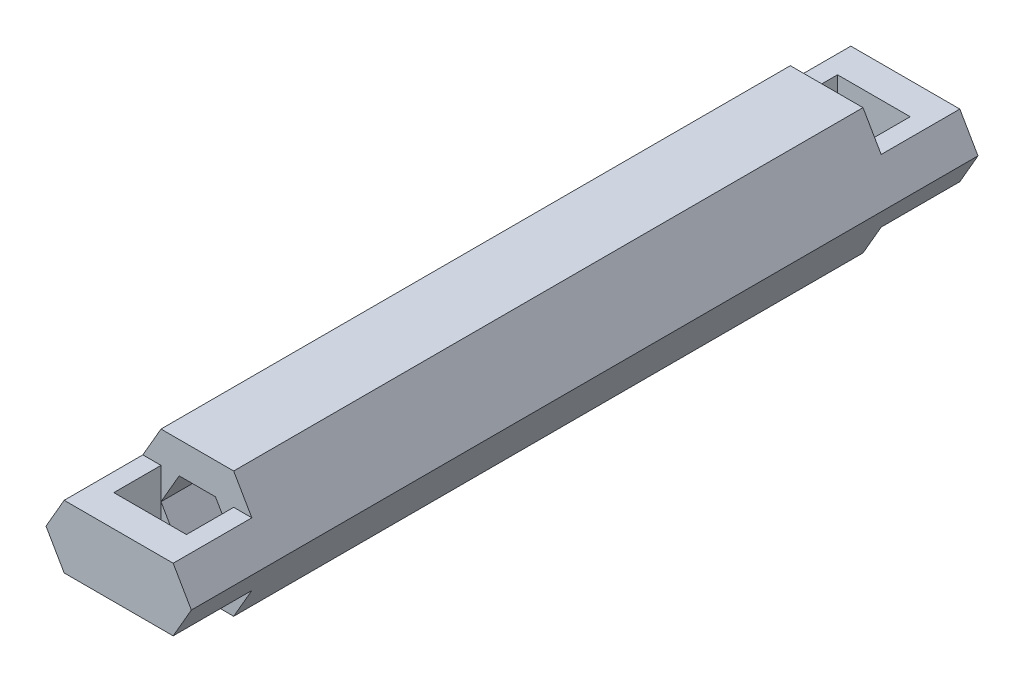
ISO-10303-21;
HEADER;
FILE_DESCRIPTION(('STEP AP214'),'2;1');
FILE_NAME('part.step','',(''),(''),'','','');
FILE_SCHEMA(('AUTOMOTIVE_DESIGN { 1 0 10303 214 1 1 1 1 }'));
ENDSEC;
DATA;
#1=APPLICATION_CONTEXT('core data for automotive mechanical design processes');
#2=APPLICATION_PROTOCOL_DEFINITION('international standard','automotive_design',2000,#1);
#3=PRODUCT_CONTEXT('',#1,'mechanical');
#4=PRODUCT('Part','Part','',(#3));
#5=PRODUCT_RELATED_PRODUCT_CATEGORY('part','',(#4));
#6=PRODUCT_DEFINITION_FORMATION('','',#4);
#7=PRODUCT_DEFINITION_CONTEXT('part definition',#1,'design');
#8=PRODUCT_DEFINITION('design','',#6,#7);
#9=PRODUCT_DEFINITION_SHAPE('','',#8);
#10=(LENGTH_UNIT() NAMED_UNIT(*) SI_UNIT(.MILLI.,.METRE.));
#11=(NAMED_UNIT(*) PLANE_ANGLE_UNIT() SI_UNIT($,.RADIAN.));
#12=(NAMED_UNIT(*) SI_UNIT($,.STERADIAN.) SOLID_ANGLE_UNIT());
#13=UNCERTAINTY_MEASURE_WITH_UNIT(LENGTH_MEASURE(1.E-05),#10,'distance_accuracy_value','');
#14=(GEOMETRIC_REPRESENTATION_CONTEXT(3) GLOBAL_UNCERTAINTY_ASSIGNED_CONTEXT((#13)) GLOBAL_UNIT_ASSIGNED_CONTEXT((#10,
#11,#12)) REPRESENTATION_CONTEXT('',''));
#15=CARTESIAN_POINT('',(0.,0.,0.));
#16=DIRECTION('',(0.,0.,1.));
#17=DIRECTION('',(1.,0.,0.));
#18=AXIS2_PLACEMENT_3D('',#15,#16,#17);
#19=CARTESIAN_POINT('',(0.,0.,0.));
#20=DIRECTION('',(0.,0.,1.));
#21=DIRECTION('',(1.,0.,0.));
#22=AXIS2_PLACEMENT_3D('',#19,#20,#21);
#23=PLANE('',#22);
#24=DIRECTION('',(0.,1.,0.));
#25=VECTOR('',#24,1.);
#26=CARTESIAN_POINT('',(-5.7735026918962,-5.00000000000001,0.));
#27=LINE('',#26,#25);
#28=CARTESIAN_POINT('',(-5.77350269189623,0.,0.));
#29=VERTEX_POINT('',#28);
#30=CARTESIAN_POINT('',(-5.77350269189627,5.00000000000001,0.));
#31=VERTEX_POINT('',#30);
#32=EDGE_CURVE('E259',#29,#31,#27,.T.);
#33=ORIENTED_EDGE('',*,*,#32,.T.);
#34=DIRECTION('',(-1.,0.,0.));
#35=VECTOR('',#34,1.);
#36=CARTESIAN_POINT('',(-8.66025403784437,5.00000000000001,0.));
#37=LINE('',#36,#35);
#38=CARTESIAN_POINT('',(-8.66025403784437,5.00000000000001,0.));
#39=VERTEX_POINT('',#38);
#40=EDGE_CURVE('E256',#31,#39,#37,.T.);
#41=ORIENTED_EDGE('',*,*,#40,.T.);
#42=DIRECTION('',(-0.5,-0.866025403784439,0.));
#43=VECTOR('',#42,1.);
#44=CARTESIAN_POINT('',(-5.77350269189626,10.,0.));
#45=LINE('',#44,#43);
#46=CARTESIAN_POINT('',(-5.77350269189626,10.,0.));
#47=VERTEX_POINT('',#46);
#48=EDGE_CURVE('E424',#47,#39,#45,.T.);
#49=ORIENTED_EDGE('',*,*,#48,.F.);
#50=DIRECTION('',(-1.,0.,0.));
#51=VECTOR('',#50,1.);
#52=CARTESIAN_POINT('',(5.77350269189625,10.,0.));
#53=LINE('',#52,#51);
#54=CARTESIAN_POINT('',(5.77350269189625,10.,0.));
#55=VERTEX_POINT('',#54);
#56=EDGE_CURVE('E422',#55,#47,#53,.T.);
#57=ORIENTED_EDGE('',*,*,#56,.F.);
#58=DIRECTION('',(-0.5,0.866025403784439,0.));
#59=VECTOR('',#58,1.);
#60=CARTESIAN_POINT('',(11.5470053837925,0.,0.));
#61=LINE('',#60,#59);
#62=CARTESIAN_POINT('',(8.66025403784437,5.00000000000001,0.));
#63=VERTEX_POINT('',#62);
#64=EDGE_CURVE('E420',#63,#55,#61,.T.);
#65=ORIENTED_EDGE('',*,*,#64,.F.);
#66=DIRECTION('',(-1.,0.,0.));
#67=VECTOR('',#66,1.);
#68=CARTESIAN_POINT('',(5.77350269189627,5.00000000000001,0.));
#69=LINE('',#68,#67);
#70=CARTESIAN_POINT('',(5.77350269189627,5.00000000000001,0.));
#71=VERTEX_POINT('',#70);
#72=EDGE_CURVE('E275',#63,#71,#69,.T.);
#73=ORIENTED_EDGE('',*,*,#72,.T.);
#74=DIRECTION('',(0.,-1.,0.));
#75=VECTOR('',#74,1.);
#76=CARTESIAN_POINT('',(5.77350269189634,-5.00000000000001,0.));
#77=LINE('',#76,#75);
#78=CARTESIAN_POINT('',(5.7735026918963,0.,0.));
#79=VERTEX_POINT('',#78);
#80=EDGE_CURVE('E44',#71,#79,#77,.T.);
#81=ORIENTED_EDGE('',*,*,#80,.T.);
#82=DIRECTION('',(-0.500000000000001,0.866025403784438,0.));
#83=VECTOR('',#82,1.);
#84=CARTESIAN_POINT('',(5.77350269189626,0.,0.));
#85=LINE('',#84,#83);
#86=CARTESIAN_POINT('',(2.88675134594812,5.00000000000001,0.));
#87=VERTEX_POINT('',#86);
#88=EDGE_CURVE('E375',#79,#87,#85,.T.);
#89=ORIENTED_EDGE('',*,*,#88,.T.);
#90=DIRECTION('',(-1.,0.,0.));
#91=VECTOR('',#90,1.);
#92=CARTESIAN_POINT('',(2.88675134594812,5.00000000000001,0.));
#93=LINE('',#92,#91);
#94=CARTESIAN_POINT('',(-2.88675134594815,4.99999999999999,0.));
#95=VERTEX_POINT('',#94);
#96=EDGE_CURVE('E378',#87,#95,#93,.T.);
#97=ORIENTED_EDGE('',*,*,#96,.T.);
#98=DIRECTION('',(-0.499999999999995,-0.866025403784441,0.));
#99=VECTOR('',#98,1.);
#100=CARTESIAN_POINT('',(-2.88675134594815,4.99999999999999,0.));
#101=LINE('',#100,#99);
#102=EDGE_CURVE('E381',#95,#29,#101,.T.);
#103=ORIENTED_EDGE('',*,*,#102,.T.);
#104=EDGE_LOOP('',(#33,#41,#49,#57,#65,#73,#81,#89,#97,#103));
#105=FACE_BOUND('',#104,.T.);
#106=ADVANCED_FACE('F33',(#105),#23,.F.);
#107=CARTESIAN_POINT('',(5.77350269189634,-5.00000000000001,112.5));
#108=DIRECTION('',(1.,0.,0.));
#109=DIRECTION('',(0.,1.,0.));
#110=AXIS2_PLACEMENT_3D('',#107,#108,#109);
#111=PLANE('',#110);
#112=DIRECTION('',(0.,1.,0.));
#113=VECTOR('',#112,1.);
#114=CARTESIAN_POINT('',(5.77350269189627,4.99999999999999,107.5));
#115=LINE('',#114,#113);
#116=CARTESIAN_POINT('',(5.77350269189634,-5.00000000000003,107.5));
#117=VERTEX_POINT('',#116);
#118=CARTESIAN_POINT('',(5.77350269189627,4.99999999999999,107.5));
#119=VERTEX_POINT('',#118);
#120=EDGE_CURVE('E293',#117,#119,#115,.T.);
#121=ORIENTED_EDGE('',*,*,#120,.T.);
#122=DIRECTION('',(0.,0.,-1.));
#123=VECTOR('',#122,1.);
#124=CARTESIAN_POINT('',(5.77350269189627,5.00000000000001,112.5));
#125=LINE('',#124,#123);
#126=CARTESIAN_POINT('',(5.77350269189627,5.00000000000001,100.));
#127=VERTEX_POINT('',#126);
#128=EDGE_CURVE('E350',#119,#127,#125,.T.);
#129=ORIENTED_EDGE('',*,*,#128,.T.);
#130=DIRECTION('',(0.,-1.,0.));
#131=VECTOR('',#130,1.);
#132=CARTESIAN_POINT('',(5.77350269189634,-5.00000000000001,100.));
#133=LINE('',#132,#131);
#134=CARTESIAN_POINT('',(5.77350269189626,0.,100.));
#135=VERTEX_POINT('',#134);
#136=EDGE_CURVE('E341',#127,#135,#133,.T.);
#137=ORIENTED_EDGE('',*,*,#136,.T.);
#138=CARTESIAN_POINT('',(5.77350269189634,-5.00000000000001,100.));
#139=VERTEX_POINT('',#138);
#140=EDGE_CURVE('E42',#135,#139,#133,.T.);
#141=ORIENTED_EDGE('',*,*,#140,.T.);
#142=DIRECTION('',(0.,0.,-1.));
#143=VECTOR('',#142,1.);
#144=CARTESIAN_POINT('',(5.77350269189634,-5.00000000000001,112.5));
#145=LINE('',#144,#143);
#146=EDGE_CURVE('E348',#117,#139,#145,.T.);
#147=ORIENTED_EDGE('',*,*,#146,.F.);
#148=EDGE_LOOP('',(#121,#129,#137,#141,#147));
#149=FACE_BOUND('',#148,.T.);
#150=ADVANCED_FACE('F445',(#149),#111,.F.);
#151=CARTESIAN_POINT('',(-5.7735026918962,-5.00000000000001,112.5));
#152=DIRECTION('',(-1.,0.,0.));
#153=DIRECTION('',(0.,-1.,0.));
#154=AXIS2_PLACEMENT_3D('',#151,#152,#153);
#155=PLANE('',#154);
#156=DIRECTION('',(0.,1.,0.));
#157=VECTOR('',#156,1.);
#158=CARTESIAN_POINT('',(-5.77350269189627,4.9999999999999,107.5));
#159=LINE('',#158,#157);
#160=CARTESIAN_POINT('',(-5.7735026918962,-5.00000000000011,107.5));
#161=VERTEX_POINT('',#160);
#162=CARTESIAN_POINT('',(-5.77350269189627,4.9999999999999,107.5));
#163=VERTEX_POINT('',#162);
#164=EDGE_CURVE('E294',#161,#163,#159,.T.);
#165=ORIENTED_EDGE('',*,*,#164,.F.);
#166=DIRECTION('',(0.,0.,-1.));
#167=VECTOR('',#166,1.);
#168=CARTESIAN_POINT('',(-5.7735026918962,-5.00000000000001,112.5));
#169=LINE('',#168,#167);
#170=CARTESIAN_POINT('',(-5.7735026918962,-5.00000000000001,100.));
#171=VERTEX_POINT('',#170);
#172=EDGE_CURVE('E321',#161,#171,#169,.T.);
#173=ORIENTED_EDGE('',*,*,#172,.T.);
#174=DIRECTION('',(0.,1.,0.));
#175=VECTOR('',#174,1.);
#176=CARTESIAN_POINT('',(-5.7735026918962,-5.00000000000001,100.));
#177=LINE('',#176,#175);
#178=CARTESIAN_POINT('',(-5.77350269189626,0.,100.));
#179=VERTEX_POINT('',#178);
#180=EDGE_CURVE('E312',#171,#179,#177,.T.);
#181=ORIENTED_EDGE('',*,*,#180,.T.);
#182=CARTESIAN_POINT('',(-5.77350269189627,5.00000000000001,100.));
#183=VERTEX_POINT('',#182);
#184=EDGE_CURVE('E311',#179,#183,#177,.T.);
#185=ORIENTED_EDGE('',*,*,#184,.T.);
#186=DIRECTION('',(0.,0.,-1.));
#187=VECTOR('',#186,1.);
#188=CARTESIAN_POINT('',(-5.77350269189627,5.00000000000001,112.5));
#189=LINE('',#188,#187);
#190=EDGE_CURVE('E319',#163,#183,#189,.T.);
#191=ORIENTED_EDGE('',*,*,#190,.F.);
#192=EDGE_LOOP('',(#165,#173,#181,#185,#191));
#193=FACE_BOUND('',#192,.T.);
#194=ADVANCED_FACE('F494',(#193),#155,.F.);
#195=CARTESIAN_POINT('',(0.,0.,100.));
#196=DIRECTION('',(0.,0.,1.));
#197=DIRECTION('',(1.,0.,0.));
#198=AXIS2_PLACEMENT_3D('',#195,#196,#197);
#199=PLANE('',#198);
#200=ORIENTED_EDGE('',*,*,#180,.F.);
#201=DIRECTION('',(1.,0.,0.));
#202=VECTOR('',#201,1.);
#203=CARTESIAN_POINT('',(-8.66025403784437,-5.00000000000001,100.));
#204=LINE('',#203,#202);
#205=CARTESIAN_POINT('',(-8.66025403784437,-5.00000000000001,100.));
#206=VERTEX_POINT('',#205);
#207=EDGE_CURVE('E297',#206,#171,#204,.T.);
#208=ORIENTED_EDGE('',*,*,#207,.F.);
#209=DIRECTION('',(0.5,-0.866025403784438,0.));
#210=VECTOR('',#209,1.);
#211=CARTESIAN_POINT('',(-11.5470053837925,0.,100.));
#212=LINE('',#211,#210);
#213=CARTESIAN_POINT('',(-5.77350269189626,-10.,100.));
#214=VERTEX_POINT('',#213);
#215=EDGE_CURVE('E413',#206,#214,#212,.T.);
#216=ORIENTED_EDGE('',*,*,#215,.T.);
#217=DIRECTION('',(1.,0.,0.));
#218=VECTOR('',#217,1.);
#219=CARTESIAN_POINT('',(-5.77350269189626,-10.,100.));
#220=LINE('',#219,#218);
#221=CARTESIAN_POINT('',(5.77350269189626,-10.,100.));
#222=VERTEX_POINT('',#221);
#223=EDGE_CURVE('E415',#214,#222,#220,.T.);
#224=ORIENTED_EDGE('',*,*,#223,.T.);
#225=DIRECTION('',(0.5,0.866025403784439,0.));
#226=VECTOR('',#225,1.);
#227=CARTESIAN_POINT('',(5.77350269189626,-10.,100.));
#228=LINE('',#227,#226);
#229=CARTESIAN_POINT('',(8.66025403784438,-5.00000000000001,100.));
#230=VERTEX_POINT('',#229);
#231=EDGE_CURVE('E404',#222,#230,#228,.T.);
#232=ORIENTED_EDGE('',*,*,#231,.T.);
#233=DIRECTION('',(1.,0.,0.));
#234=VECTOR('',#233,1.);
#235=CARTESIAN_POINT('',(5.77350269189634,-5.00000000000001,100.));
#236=LINE('',#235,#234);
#237=EDGE_CURVE('E331',#139,#230,#236,.T.);
#238=ORIENTED_EDGE('',*,*,#237,.F.);
#239=ORIENTED_EDGE('',*,*,#140,.F.);
#240=DIRECTION('',(0.499999999999995,0.866025403784442,0.));
#241=VECTOR('',#240,1.);
#242=CARTESIAN_POINT('',(2.88675134594819,-4.99999999999997,100.));
#243=LINE('',#242,#241);
#244=CARTESIAN_POINT('',(2.88675134594819,-4.99999999999997,100.));
#245=VERTEX_POINT('',#244);
#246=EDGE_CURVE('E356',#245,#135,#243,.T.);
#247=ORIENTED_EDGE('',*,*,#246,.F.);
#248=DIRECTION('',(1.,0.,0.));
#249=VECTOR('',#248,1.);
#250=CARTESIAN_POINT('',(-2.88675134594808,-5.00000000000003,100.));
#251=LINE('',#250,#249);
#252=CARTESIAN_POINT('',(-2.88675134594808,-5.00000000000003,100.));
#253=VERTEX_POINT('',#252);
#254=EDGE_CURVE('E370',#253,#245,#251,.T.);
#255=ORIENTED_EDGE('',*,*,#254,.F.);
#256=DIRECTION('',(0.500000000000007,-0.866025403784434,0.));
#257=VECTOR('',#256,1.);
#258=CARTESIAN_POINT('',(-5.77350269189626,0.,100.));
#259=LINE('',#258,#257);
#260=EDGE_CURVE('E367',#179,#253,#259,.T.);
#261=ORIENTED_EDGE('',*,*,#260,.F.);
#262=EDGE_LOOP('',(#200,#208,#216,#224,#232,#238,#239,#247,#255,#261));
#263=FACE_BOUND('',#262,.T.);
#264=ADVANCED_FACE('F451',(#263),#199,.T.);
#265=DIRECTION('',(-1.,0.,0.));
#266=VECTOR('',#265,1.);
#267=CARTESIAN_POINT('',(-8.66025403784437,5.00000000000001,100.));
#268=LINE('',#267,#266);
#269=CARTESIAN_POINT('',(-8.66025403784439,5.,100.));
#270=VERTEX_POINT('',#269);
#271=EDGE_CURVE('E306',#183,#270,#268,.T.);
#272=ORIENTED_EDGE('',*,*,#271,.F.);
#273=ORIENTED_EDGE('',*,*,#184,.F.);
#274=DIRECTION('',(-0.499999999999995,-0.866025403784441,0.));
#275=VECTOR('',#274,1.);
#276=CARTESIAN_POINT('',(-2.88675134594815,4.99999999999999,100.));
#277=LINE('',#276,#275);
#278=CARTESIAN_POINT('',(-2.88675134594815,4.99999999999999,100.));
#279=VERTEX_POINT('',#278);
#280=EDGE_CURVE('E364',#279,#179,#277,.T.);
#281=ORIENTED_EDGE('',*,*,#280,.F.);
#282=DIRECTION('',(-1.,0.,0.));
#283=VECTOR('',#282,1.);
#284=CARTESIAN_POINT('',(2.88675134594812,5.00000000000001,100.));
#285=LINE('',#284,#283);
#286=CARTESIAN_POINT('',(2.88675134594812,5.00000000000001,100.));
#287=VERTEX_POINT('',#286);
#288=EDGE_CURVE('E362',#287,#279,#285,.T.);
#289=ORIENTED_EDGE('',*,*,#288,.F.);
#290=DIRECTION('',(-0.500000000000001,0.866025403784438,0.));
#291=VECTOR('',#290,1.);
#292=CARTESIAN_POINT('',(5.77350269189626,0.,100.));
#293=LINE('',#292,#291);
#294=EDGE_CURVE('E359',#135,#287,#293,.T.);
#295=ORIENTED_EDGE('',*,*,#294,.F.);
#296=ORIENTED_EDGE('',*,*,#136,.F.);
#297=DIRECTION('',(-1.,0.,0.));
#298=VECTOR('',#297,1.);
#299=CARTESIAN_POINT('',(5.77350269189627,5.00000000000001,100.));
#300=LINE('',#299,#298);
#301=CARTESIAN_POINT('',(8.66025403784438,5.00000000000001,100.));
#302=VERTEX_POINT('',#301);
#303=EDGE_CURVE('E326',#302,#127,#300,.T.);
#304=ORIENTED_EDGE('',*,*,#303,.F.);
#305=DIRECTION('',(-0.5,0.866025403784439,0.));
#306=VECTOR('',#305,1.);
#307=CARTESIAN_POINT('',(11.5470053837925,0.,100.));
#308=LINE('',#307,#306);
#309=CARTESIAN_POINT('',(5.77350269189625,10.,100.));
#310=VERTEX_POINT('',#309);
#311=EDGE_CURVE('E406',#302,#310,#308,.T.);
#312=ORIENTED_EDGE('',*,*,#311,.T.);
#313=DIRECTION('',(-1.,0.,0.));
#314=VECTOR('',#313,1.);
#315=CARTESIAN_POINT('',(5.77350269189625,10.,100.));
#316=LINE('',#315,#314);
#317=CARTESIAN_POINT('',(-5.77350269189626,10.,100.));
#318=VERTEX_POINT('',#317);
#319=EDGE_CURVE('E409',#310,#318,#316,.T.);
#320=ORIENTED_EDGE('',*,*,#319,.T.);
#321=DIRECTION('',(-0.5,-0.866025403784439,0.));
#322=VECTOR('',#321,1.);
#323=CARTESIAN_POINT('',(-5.77350269189626,10.,100.));
#324=LINE('',#323,#322);
#325=EDGE_CURVE('E411',#318,#270,#324,.T.);
#326=ORIENTED_EDGE('',*,*,#325,.T.);
#327=EDGE_LOOP('',(#272,#273,#281,#289,#295,#296,#304,#312,#320,#326));
#328=FACE_BOUND('',#327,.T.);
#329=ADVANCED_FACE('F465',(#328),#199,.T.);
#330=DIRECTION('',(1.,0.,0.));
#331=VECTOR('',#330,1.);
#332=CARTESIAN_POINT('',(-8.66025403784437,-5.00000000000001,0.));
#333=LINE('',#332,#331);
#334=CARTESIAN_POINT('',(-8.66025403784438,-5.00000000000001,0.));
#335=VERTEX_POINT('',#334);
#336=CARTESIAN_POINT('',(-5.7735026918962,-5.00000000000001,0.));
#337=VERTEX_POINT('',#336);
#338=EDGE_CURVE('E244',#335,#337,#333,.T.);
#339=ORIENTED_EDGE('',*,*,#338,.T.);
#340=EDGE_CURVE('E261',#337,#29,#27,.T.);
#341=ORIENTED_EDGE('',*,*,#340,.T.);
#342=DIRECTION('',(0.500000000000007,-0.866025403784434,0.));
#343=VECTOR('',#342,1.);
#344=CARTESIAN_POINT('',(-5.77350269189626,0.,0.));
#345=LINE('',#344,#343);
#346=CARTESIAN_POINT('',(-2.88675134594808,-5.00000000000003,0.));
#347=VERTEX_POINT('',#346);
#348=EDGE_CURVE('E384',#29,#347,#345,.T.);
#349=ORIENTED_EDGE('',*,*,#348,.T.);
#350=DIRECTION('',(1.,0.,0.));
#351=VECTOR('',#350,1.);
#352=CARTESIAN_POINT('',(-2.88675134594808,-5.00000000000003,0.));
#353=LINE('',#352,#351);
#354=CARTESIAN_POINT('',(2.88675134594819,-4.99999999999997,0.));
#355=VERTEX_POINT('',#354);
#356=EDGE_CURVE('E360',#347,#355,#353,.T.);
#357=ORIENTED_EDGE('',*,*,#356,.T.);
#358=DIRECTION('',(0.499999999999995,0.866025403784442,0.));
#359=VECTOR('',#358,1.);
#360=CARTESIAN_POINT('',(2.88675134594819,-4.99999999999997,0.));
#361=LINE('',#360,#359);
#362=EDGE_CURVE('E355',#355,#79,#361,.T.);
#363=ORIENTED_EDGE('',*,*,#362,.T.);
#364=CARTESIAN_POINT('',(5.77350269189634,-5.00000000000001,0.));
#365=VERTEX_POINT('',#364);
#366=EDGE_CURVE('E11',#79,#365,#77,.T.);
#367=ORIENTED_EDGE('',*,*,#366,.T.);
#368=DIRECTION('',(1.,0.,0.));
#369=VECTOR('',#368,1.);
#370=CARTESIAN_POINT('',(5.77350269189634,-5.00000000000001,0.));
#371=LINE('',#370,#369);
#372=CARTESIAN_POINT('',(8.66025403784438,-5.00000000000001,0.));
#373=VERTEX_POINT('',#372);
#374=EDGE_CURVE('E270',#365,#373,#371,.T.);
#375=ORIENTED_EDGE('',*,*,#374,.T.);
#376=DIRECTION('',(0.5,0.866025403784439,0.));
#377=VECTOR('',#376,1.);
#378=CARTESIAN_POINT('',(5.77350269189626,-10.,0.));
#379=LINE('',#378,#377);
#380=CARTESIAN_POINT('',(5.77350269189626,-10.,0.));
#381=VERTEX_POINT('',#380);
#382=EDGE_CURVE('E403',#381,#373,#379,.T.);
#383=ORIENTED_EDGE('',*,*,#382,.F.);
#384=DIRECTION('',(1.,0.,0.));
#385=VECTOR('',#384,1.);
#386=CARTESIAN_POINT('',(-5.77350269189626,-10.,0.));
#387=LINE('',#386,#385);
#388=CARTESIAN_POINT('',(-5.77350269189626,-10.,0.));
#389=VERTEX_POINT('',#388);
#390=EDGE_CURVE('E407',#389,#381,#387,.T.);
#391=ORIENTED_EDGE('',*,*,#390,.F.);
#392=DIRECTION('',(0.5,-0.866025403784438,0.));
#393=VECTOR('',#392,1.);
#394=CARTESIAN_POINT('',(-11.5470053837925,0.,0.));
#395=LINE('',#394,#393);
#396=EDGE_CURVE('E426',#335,#389,#395,.T.);
#397=ORIENTED_EDGE('',*,*,#396,.F.);
#398=EDGE_LOOP('',(#339,#341,#349,#357,#363,#367,#375,#383,#391,#397));
#399=FACE_BOUND('',#398,.T.);
#400=ADVANCED_FACE('F483',(#399),#23,.F.);
#401=CARTESIAN_POINT('',(5.77350269189626,-10.,100.));
#402=DIRECTION('',(-0.866025403784439,0.5,0.));
#403=DIRECTION('',(-0.5,-0.866025403784439,0.));
#404=AXIS2_PLACEMENT_3D('',#401,#402,#403);
#405=PLANE('',#404);
#406=ORIENTED_EDGE('',*,*,#382,.T.);
#407=DIRECTION('',(0.,0.,1.));
#408=VECTOR('',#407,1.);
#409=CARTESIAN_POINT('',(8.66025403784437,-5.00000000000001,-12.5));
#410=LINE('',#409,#408);
#411=CARTESIAN_POINT('',(8.66025403784437,-5.00000000000001,-12.5));
#412=VERTEX_POINT('',#411);
#413=EDGE_CURVE('E291',#412,#373,#410,.T.);
#414=ORIENTED_EDGE('',*,*,#413,.F.);
#415=DIRECTION('',(0.500000000000001,0.866025403784438,0.));
#416=VECTOR('',#415,1.);
#417=CARTESIAN_POINT('',(8.66025403784437,-5.00000000000001,-12.5));
#418=LINE('',#417,#416);
#419=CARTESIAN_POINT('',(11.5470053837925,0.,-12.5));
#420=VERTEX_POINT('',#419);
#421=EDGE_CURVE('E274',#412,#420,#418,.T.);
#422=ORIENTED_EDGE('',*,*,#421,.T.);
#423=DIRECTION('',(0.,0.,-1.));
#424=VECTOR('',#423,1.);
#425=CARTESIAN_POINT('',(11.5470053837925,0.,100.));
#426=LINE('',#425,#424);
#427=CARTESIAN_POINT('',(11.5470053837925,0.,112.5));
#428=VERTEX_POINT('',#427);
#429=EDGE_CURVE('E37',#428,#420,#426,.T.);
#430=ORIENTED_EDGE('',*,*,#429,.F.);
#431=DIRECTION('',(0.500000000000001,0.866025403784438,0.));
#432=VECTOR('',#431,1.);
#433=CARTESIAN_POINT('',(8.66025403784437,-5.00000000000001,112.5));
#434=LINE('',#433,#432);
#435=CARTESIAN_POINT('',(8.66025403784437,-5.00000000000001,112.5));
#436=VERTEX_POINT('',#435);
#437=EDGE_CURVE('E335',#436,#428,#434,.T.);
#438=ORIENTED_EDGE('',*,*,#437,.F.);
#439=DIRECTION('',(0.,0.,-1.));
#440=VECTOR('',#439,1.);
#441=CARTESIAN_POINT('',(8.66025403784437,-5.00000000000001,112.5));
#442=LINE('',#441,#440);
#443=EDGE_CURVE('E338',#436,#230,#442,.T.);
#444=ORIENTED_EDGE('',*,*,#443,.T.);
#445=ORIENTED_EDGE('',*,*,#231,.F.);
#446=DIRECTION('',(0.,0.,-1.));
#447=VECTOR('',#446,1.);
#448=CARTESIAN_POINT('',(5.77350269189626,-10.,100.));
#449=LINE('',#448,#447);
#450=EDGE_CURVE('E417',#222,#381,#449,.T.);
#451=ORIENTED_EDGE('',*,*,#450,.T.);
#452=EDGE_LOOP('',(#406,#414,#422,#430,#438,#444,#445,#451));
#453=FACE_BOUND('',#452,.T.);
#454=ADVANCED_FACE('F35',(#453),#405,.F.);
#455=CARTESIAN_POINT('',(11.5470053837925,0.,100.));
#456=DIRECTION('',(-0.866025403784439,-0.5,0.));
#457=DIRECTION('',(0.5,-0.866025403784439,0.));
#458=AXIS2_PLACEMENT_3D('',#455,#456,#457);
#459=PLANE('',#458);
#460=ORIENTED_EDGE('',*,*,#429,.T.);
#461=DIRECTION('',(-0.500000000000001,0.866025403784438,0.));
#462=VECTOR('',#461,1.);
#463=CARTESIAN_POINT('',(11.5470053837925,0.,-12.5));
#464=LINE('',#463,#462);
#465=CARTESIAN_POINT('',(8.66025403784437,5.00000000000001,-12.5));
#466=VERTEX_POINT('',#465);
#467=EDGE_CURVE('E271',#420,#466,#464,.T.);
#468=ORIENTED_EDGE('',*,*,#467,.T.);
#469=DIRECTION('',(0.,0.,1.));
#470=VECTOR('',#469,1.);
#471=CARTESIAN_POINT('',(8.66025403784437,5.00000000000001,-12.5));
#472=LINE('',#471,#470);
#473=EDGE_CURVE('E281',#466,#63,#472,.T.);
#474=ORIENTED_EDGE('',*,*,#473,.T.);
#475=ORIENTED_EDGE('',*,*,#64,.T.);
#476=DIRECTION('',(0.,0.,-1.));
#477=VECTOR('',#476,1.);
#478=CARTESIAN_POINT('',(5.77350269189625,10.,100.));
#479=LINE('',#478,#477);
#480=EDGE_CURVE('E434',#310,#55,#479,.T.);
#481=ORIENTED_EDGE('',*,*,#480,.F.);
#482=ORIENTED_EDGE('',*,*,#311,.F.);
#483=DIRECTION('',(0.,0.,-1.));
#484=VECTOR('',#483,1.);
#485=CARTESIAN_POINT('',(8.66025403784437,5.00000000000001,112.5));
#486=LINE('',#485,#484);
#487=CARTESIAN_POINT('',(8.66025403784437,5.00000000000001,112.5));
#488=VERTEX_POINT('',#487);
#489=EDGE_CURVE('E352',#488,#302,#486,.T.);
#490=ORIENTED_EDGE('',*,*,#489,.F.);
#491=DIRECTION('',(-0.500000000000001,0.866025403784438,0.));
#492=VECTOR('',#491,1.);
#493=CARTESIAN_POINT('',(11.5470053837925,0.,112.5));
#494=LINE('',#493,#492);
#495=EDGE_CURVE('E327',#428,#488,#494,.T.);
#496=ORIENTED_EDGE('',*,*,#495,.F.);
#497=EDGE_LOOP('',(#460,#468,#474,#475,#481,#482,#490,#496));
#498=FACE_BOUND('',#497,.T.);
#499=ADVANCED_FACE('F514',(#498),#459,.F.);
#500=CARTESIAN_POINT('',(5.77350269189625,10.,100.));
#501=DIRECTION('',(0.,-1.,0.));
#502=DIRECTION('',(0.,0.,-1.));
#503=AXIS2_PLACEMENT_3D('',#500,#501,#502);
#504=PLANE('',#503);
#505=ORIENTED_EDGE('',*,*,#56,.T.);
#506=DIRECTION('',(0.,0.,-1.));
#507=VECTOR('',#506,1.);
#508=CARTESIAN_POINT('',(-5.77350269189626,10.,100.));
#509=LINE('',#508,#507);
#510=EDGE_CURVE('E231',#318,#47,#509,.T.);
#511=ORIENTED_EDGE('',*,*,#510,.F.);
#512=ORIENTED_EDGE('',*,*,#319,.F.);
#513=ORIENTED_EDGE('',*,*,#480,.T.);
#514=EDGE_LOOP('',(#505,#511,#512,#513));
#515=FACE_BOUND('',#514,.T.);
#516=ADVANCED_FACE('F658',(#515),#504,.F.);
#517=CARTESIAN_POINT('',(-5.77350269189626,10.,100.));
#518=DIRECTION('',(0.866025403784439,-0.5,0.));
#519=DIRECTION('',(0.5,0.866025403784439,0.));
#520=AXIS2_PLACEMENT_3D('',#517,#518,#519);
#521=PLANE('',#520);
#522=ORIENTED_EDGE('',*,*,#48,.T.);
#523=DIRECTION('',(0.,0.,1.));
#524=VECTOR('',#523,1.);
#525=CARTESIAN_POINT('',(-8.66025403784437,5.00000000000001,-12.5));
#526=LINE('',#525,#524);
#527=CARTESIAN_POINT('',(-8.66025403784437,5.00000000000001,-12.5));
#528=VERTEX_POINT('',#527);
#529=EDGE_CURVE('E249',#528,#39,#526,.T.);
#530=ORIENTED_EDGE('',*,*,#529,.F.);
#531=DIRECTION('',(-0.499999999999995,-0.866025403784442,0.));
#532=VECTOR('',#531,1.);
#533=CARTESIAN_POINT('',(-8.66025403784437,5.00000000000001,-12.5));
#534=LINE('',#533,#532);
#535=CARTESIAN_POINT('',(-11.5470053837925,0.,-12.5));
#536=VERTEX_POINT('',#535);
#537=EDGE_CURVE('E239',#528,#536,#534,.T.);
#538=ORIENTED_EDGE('',*,*,#537,.T.);
#539=DIRECTION('',(0.,0.,-1.));
#540=VECTOR('',#539,1.);
#541=CARTESIAN_POINT('',(-11.5470053837925,0.,100.));
#542=LINE('',#541,#540);
#543=CARTESIAN_POINT('',(-11.5470053837925,0.,112.5));
#544=VERTEX_POINT('',#543);
#545=EDGE_CURVE('E219',#544,#536,#542,.T.);
#546=ORIENTED_EDGE('',*,*,#545,.F.);
#547=DIRECTION('',(-0.499999999999995,-0.866025403784442,0.));
#548=VECTOR('',#547,1.);
#549=CARTESIAN_POINT('',(-8.66025403784437,5.00000000000001,112.5));
#550=LINE('',#549,#548);
#551=CARTESIAN_POINT('',(-8.66025403784437,5.00000000000001,112.5));
#552=VERTEX_POINT('',#551);
#553=EDGE_CURVE('E305',#552,#544,#550,.T.);
#554=ORIENTED_EDGE('',*,*,#553,.F.);
#555=DIRECTION('',(0.,0.,-1.));
#556=VECTOR('',#555,1.);
#557=CARTESIAN_POINT('',(-8.66025403784437,5.00000000000001,112.5));
#558=LINE('',#557,#556);
#559=EDGE_CURVE('E308',#552,#270,#558,.T.);
#560=ORIENTED_EDGE('',*,*,#559,.T.);
#561=ORIENTED_EDGE('',*,*,#325,.F.);
#562=ORIENTED_EDGE('',*,*,#510,.T.);
#563=EDGE_LOOP('',(#522,#530,#538,#546,#554,#560,#561,#562));
#564=FACE_BOUND('',#563,.T.);
#565=ADVANCED_FACE('F248',(#564),#521,.F.);
#566=CARTESIAN_POINT('',(-11.5470053837925,0.,100.));
#567=DIRECTION('',(0.866025403784438,0.5,0.));
#568=DIRECTION('',(-0.5,0.866025403784438,0.));
#569=AXIS2_PLACEMENT_3D('',#566,#567,#568);
#570=PLANE('',#569);
#571=ORIENTED_EDGE('',*,*,#545,.T.);
#572=DIRECTION('',(0.500000000000007,-0.866025403784435,0.));
#573=VECTOR('',#572,1.);
#574=CARTESIAN_POINT('',(-11.5470053837925,0.,-12.5));
#575=LINE('',#574,#573);
#576=CARTESIAN_POINT('',(-8.66025403784437,-5.00000000000001,-12.5));
#577=VERTEX_POINT('',#576);
#578=EDGE_CURVE('E223',#536,#577,#575,.T.);
#579=ORIENTED_EDGE('',*,*,#578,.T.);
#580=DIRECTION('',(0.,0.,1.));
#581=VECTOR('',#580,1.);
#582=CARTESIAN_POINT('',(-8.66025403784437,-5.00000000000001,-12.5));
#583=LINE('',#582,#581);
#584=EDGE_CURVE('E250',#577,#335,#583,.T.);
#585=ORIENTED_EDGE('',*,*,#584,.T.);
#586=ORIENTED_EDGE('',*,*,#396,.T.);
#587=DIRECTION('',(0.,0.,-1.));
#588=VECTOR('',#587,1.);
#589=CARTESIAN_POINT('',(-5.77350269189626,-10.,100.));
#590=LINE('',#589,#588);
#591=EDGE_CURVE('E232',#214,#389,#590,.T.);
#592=ORIENTED_EDGE('',*,*,#591,.F.);
#593=ORIENTED_EDGE('',*,*,#215,.F.);
#594=DIRECTION('',(0.,0.,-1.));
#595=VECTOR('',#594,1.);
#596=CARTESIAN_POINT('',(-8.66025403784437,-5.00000000000001,112.5));
#597=LINE('',#596,#595);
#598=CARTESIAN_POINT('',(-8.66025403784437,-5.00000000000001,112.5));
#599=VERTEX_POINT('',#598);
#600=EDGE_CURVE('E323',#599,#206,#597,.T.);
#601=ORIENTED_EDGE('',*,*,#600,.F.);
#602=DIRECTION('',(0.500000000000007,-0.866025403784435,0.));
#603=VECTOR('',#602,1.);
#604=CARTESIAN_POINT('',(-11.5470053837925,0.,112.5));
#605=LINE('',#604,#603);
#606=EDGE_CURVE('E226',#544,#599,#605,.T.);
#607=ORIENTED_EDGE('',*,*,#606,.F.);
#608=EDGE_LOOP('',(#571,#579,#585,#586,#592,#593,#601,#607));
#609=FACE_BOUND('',#608,.T.);
#610=ADVANCED_FACE('F221',(#609),#570,.F.);
#611=CARTESIAN_POINT('',(-5.77350269189626,-10.,100.));
#612=DIRECTION('',(0.,1.,0.));
#613=DIRECTION('',(0.,0.,1.));
#614=AXIS2_PLACEMENT_3D('',#611,#612,#613);
#615=PLANE('',#614);
#616=ORIENTED_EDGE('',*,*,#390,.T.);
#617=ORIENTED_EDGE('',*,*,#450,.F.);
#618=ORIENTED_EDGE('',*,*,#223,.F.);
#619=ORIENTED_EDGE('',*,*,#591,.T.);
#620=EDGE_LOOP('',(#616,#617,#618,#619));
#621=FACE_BOUND('',#620,.T.);
#622=ADVANCED_FACE('F506',(#621),#615,.F.);
#623=CARTESIAN_POINT('',(2.88675134594819,-4.99999999999997,100.));
#624=DIRECTION('',(-0.866025403784442,0.499999999999995,0.));
#625=DIRECTION('',(-0.499999999999995,-0.866025403784441,0.));
#626=AXIS2_PLACEMENT_3D('',#623,#624,#625);
#627=PLANE('',#626);
#628=ORIENTED_EDGE('',*,*,#362,.F.);
#629=DIRECTION('',(0.,0.,-1.));
#630=VECTOR('',#629,1.);
#631=CARTESIAN_POINT('',(2.88675134594819,-4.99999999999997,100.));
#632=LINE('',#631,#630);
#633=EDGE_CURVE('E372',#245,#355,#632,.T.);
#634=ORIENTED_EDGE('',*,*,#633,.F.);
#635=ORIENTED_EDGE('',*,*,#246,.T.);
#636=DIRECTION('',(0.,0.,-1.));
#637=VECTOR('',#636,1.);
#638=CARTESIAN_POINT('',(5.77350269189626,0.,100.));
#639=LINE('',#638,#637);
#640=EDGE_CURVE('E400',#135,#79,#639,.T.);
#641=ORIENTED_EDGE('',*,*,#640,.T.);
#642=EDGE_LOOP('',(#628,#634,#635,#641));
#643=FACE_BOUND('',#642,.T.);
#644=ADVANCED_FACE('F456',(#643),#627,.T.);
#645=CARTESIAN_POINT('',(5.77350269189626,0.,100.));
#646=DIRECTION('',(-0.866025403784438,-0.500000000000001,0.));
#647=DIRECTION('',(0.500000000000001,-0.866025403784438,0.));
#648=AXIS2_PLACEMENT_3D('',#645,#646,#647);
#649=PLANE('',#648);
#650=ORIENTED_EDGE('',*,*,#88,.F.);
#651=ORIENTED_EDGE('',*,*,#640,.F.);
#652=ORIENTED_EDGE('',*,*,#294,.T.);
#653=DIRECTION('',(0.,0.,-1.));
#654=VECTOR('',#653,1.);
#655=CARTESIAN_POINT('',(2.88675134594812,5.00000000000001,100.));
#656=LINE('',#655,#654);
#657=EDGE_CURVE('E398',#287,#87,#656,.T.);
#658=ORIENTED_EDGE('',*,*,#657,.T.);
#659=EDGE_LOOP('',(#650,#651,#652,#658));
#660=FACE_BOUND('',#659,.T.);
#661=ADVANCED_FACE('F460',(#660),#649,.T.);
#662=CARTESIAN_POINT('',(2.88675134594812,5.00000000000001,100.));
#663=DIRECTION('',(0.,-1.,0.));
#664=DIRECTION('',(1.,0.,0.));
#665=AXIS2_PLACEMENT_3D('',#662,#663,#664);
#666=PLANE('',#665);
#667=ORIENTED_EDGE('',*,*,#96,.F.);
#668=ORIENTED_EDGE('',*,*,#657,.F.);
#669=ORIENTED_EDGE('',*,*,#288,.T.);
#670=DIRECTION('',(0.,0.,-1.));
#671=VECTOR('',#670,1.);
#672=CARTESIAN_POINT('',(-2.88675134594815,4.99999999999999,100.));
#673=LINE('',#672,#671);
#674=EDGE_CURVE('E396',#279,#95,#673,.T.);
#675=ORIENTED_EDGE('',*,*,#674,.T.);
#676=EDGE_LOOP('',(#667,#668,#669,#675));
#677=FACE_BOUND('',#676,.T.);
#678=ADVANCED_FACE('F470',(#677),#666,.T.);
#679=CARTESIAN_POINT('',(-2.88675134594815,4.99999999999999,100.));
#680=DIRECTION('',(0.866025403784442,-0.499999999999995,0.));
#681=DIRECTION('',(0.499999999999995,0.866025403784442,0.));
#682=AXIS2_PLACEMENT_3D('',#679,#680,#681);
#683=PLANE('',#682);
#684=ORIENTED_EDGE('',*,*,#102,.F.);
#685=ORIENTED_EDGE('',*,*,#674,.F.);
#686=ORIENTED_EDGE('',*,*,#280,.T.);
#687=DIRECTION('',(0.,0.,-1.));
#688=VECTOR('',#687,1.);
#689=CARTESIAN_POINT('',(-5.77350269189626,0.,100.));
#690=LINE('',#689,#688);
#691=EDGE_CURVE('E393',#179,#29,#690,.T.);
#692=ORIENTED_EDGE('',*,*,#691,.T.);
#693=EDGE_LOOP('',(#684,#685,#686,#692));
#694=FACE_BOUND('',#693,.T.);
#695=ADVANCED_FACE('F473',(#694),#683,.T.);
#696=CARTESIAN_POINT('',(-5.77350269189626,0.,100.));
#697=DIRECTION('',(0.866025403784434,0.500000000000007,0.));
#698=DIRECTION('',(-0.500000000000007,0.866025403784435,0.));
#699=AXIS2_PLACEMENT_3D('',#696,#697,#698);
#700=PLANE('',#699);
#701=ORIENTED_EDGE('',*,*,#348,.F.);
#702=ORIENTED_EDGE('',*,*,#691,.F.);
#703=ORIENTED_EDGE('',*,*,#260,.T.);
#704=DIRECTION('',(0.,0.,-1.));
#705=VECTOR('',#704,1.);
#706=CARTESIAN_POINT('',(-2.88675134594808,-5.00000000000003,100.));
#707=LINE('',#706,#705);
#708=EDGE_CURVE('E391',#253,#347,#707,.T.);
#709=ORIENTED_EDGE('',*,*,#708,.T.);
#710=EDGE_LOOP('',(#701,#702,#703,#709));
#711=FACE_BOUND('',#710,.T.);
#712=ADVANCED_FACE('F561',(#711),#700,.T.);
#713=CARTESIAN_POINT('',(-2.88675134594808,-5.00000000000003,100.));
#714=DIRECTION('',(0.,1.,0.));
#715=DIRECTION('',(-1.,0.,0.));
#716=AXIS2_PLACEMENT_3D('',#713,#714,#715);
#717=PLANE('',#716);
#718=ORIENTED_EDGE('',*,*,#356,.F.);
#719=ORIENTED_EDGE('',*,*,#708,.F.);
#720=ORIENTED_EDGE('',*,*,#254,.T.);
#721=ORIENTED_EDGE('',*,*,#633,.T.);
#722=EDGE_LOOP('',(#718,#719,#720,#721));
#723=FACE_BOUND('',#722,.T.);
#724=ADVANCED_FACE('F487',(#723),#717,.T.);
#725=CARTESIAN_POINT('',(5.77350269189627,5.00000000000001,112.5));
#726=DIRECTION('',(0.,-1.,0.));
#727=DIRECTION('',(0.,0.,-1.));
#728=AXIS2_PLACEMENT_3D('',#725,#726,#727);
#729=PLANE('',#728);
#730=ORIENTED_EDGE('',*,*,#303,.T.);
#731=ORIENTED_EDGE('',*,*,#128,.F.);
#732=DIRECTION('',(-1.,0.,0.));
#733=VECTOR('',#732,1.);
#734=CARTESIAN_POINT('',(11.5490053837925,5.00000000000003,107.5));
#735=LINE('',#734,#733);
#736=EDGE_CURVE('E298',#119,#163,#735,.T.);
#737=ORIENTED_EDGE('',*,*,#736,.T.);
#738=ORIENTED_EDGE('',*,*,#190,.T.);
#739=ORIENTED_EDGE('',*,*,#271,.T.);
#740=ORIENTED_EDGE('',*,*,#559,.F.);
#741=DIRECTION('',(-1.,0.,0.));
#742=VECTOR('',#741,1.);
#743=CARTESIAN_POINT('',(5.77350269189627,5.00000000000001,112.5));
#744=LINE('',#743,#742);
#745=EDGE_CURVE('E330',#488,#552,#744,.T.);
#746=ORIENTED_EDGE('',*,*,#745,.F.);
#747=ORIENTED_EDGE('',*,*,#489,.T.);
#748=EDGE_LOOP('',(#730,#731,#737,#738,#739,#740,#746,#747));
#749=FACE_BOUND('',#748,.T.);
#750=ADVANCED_FACE('F517',(#749),#729,.F.);
#751=CARTESIAN_POINT('',(5.77350269189634,-5.00000000000001,112.5));
#752=DIRECTION('',(0.,1.,0.));
#753=DIRECTION('',(0.,0.,1.));
#754=AXIS2_PLACEMENT_3D('',#751,#752,#753);
#755=PLANE('',#754);
#756=ORIENTED_EDGE('',*,*,#237,.T.);
#757=ORIENTED_EDGE('',*,*,#443,.F.);
#758=DIRECTION('',(1.,0.,0.));
#759=VECTOR('',#758,1.);
#760=CARTESIAN_POINT('',(5.77350269189634,-5.00000000000001,112.5));
#761=LINE('',#760,#759);
#762=EDGE_CURVE('E333',#599,#436,#761,.T.);
#763=ORIENTED_EDGE('',*,*,#762,.F.);
#764=ORIENTED_EDGE('',*,*,#600,.T.);
#765=ORIENTED_EDGE('',*,*,#207,.T.);
#766=ORIENTED_EDGE('',*,*,#172,.F.);
#767=DIRECTION('',(-1.,0.,0.));
#768=VECTOR('',#767,1.);
#769=CARTESIAN_POINT('',(11.5490053837925,-4.99999999999999,107.5));
#770=LINE('',#769,#768);
#771=EDGE_CURVE('E299',#117,#161,#770,.T.);
#772=ORIENTED_EDGE('',*,*,#771,.F.);
#773=ORIENTED_EDGE('',*,*,#146,.T.);
#774=EDGE_LOOP('',(#756,#757,#763,#764,#765,#766,#772,#773));
#775=FACE_BOUND('',#774,.T.);
#776=ADVANCED_FACE('F499',(#775),#755,.F.);
#777=CARTESIAN_POINT('',(0.,0.,112.5));
#778=DIRECTION('',(0.,0.,-1.));
#779=DIRECTION('',(-1.,0.,0.));
#780=AXIS2_PLACEMENT_3D('',#777,#778,#779);
#781=PLANE('',#780);
#782=ORIENTED_EDGE('',*,*,#495,.T.);
#783=ORIENTED_EDGE('',*,*,#745,.T.);
#784=ORIENTED_EDGE('',*,*,#553,.T.);
#785=ORIENTED_EDGE('',*,*,#606,.T.);
#786=ORIENTED_EDGE('',*,*,#762,.T.);
#787=ORIENTED_EDGE('',*,*,#437,.T.);
#788=EDGE_LOOP('',(#782,#783,#784,#785,#786,#787));
#789=FACE_BOUND('',#788,.T.);
#790=ADVANCED_FACE('F512',(#789),#781,.F.);
#791=CARTESIAN_POINT('',(11.5490053837925,5.00000000000003,107.5));
#792=DIRECTION('',(0.,0.,1.));
#793=DIRECTION('',(1.,0.,0.));
#794=AXIS2_PLACEMENT_3D('',#791,#792,#793);
#795=PLANE('',#794);
#796=ORIENTED_EDGE('',*,*,#120,.F.);
#797=ORIENTED_EDGE('',*,*,#771,.T.);
#798=ORIENTED_EDGE('',*,*,#164,.T.);
#799=ORIENTED_EDGE('',*,*,#736,.F.);
#800=EDGE_LOOP('',(#796,#797,#798,#799));
#801=FACE_BOUND('',#800,.T.);
#802=ADVANCED_FACE('F524',(#801),#795,.F.);
#803=CARTESIAN_POINT('',(5.77350269189634,-5.00000000000001,-12.5));
#804=DIRECTION('',(0.,-1.,0.));
#805=DIRECTION('',(0.,0.,-1.));
#806=AXIS2_PLACEMENT_3D('',#803,#804,#805);
#807=PLANE('',#806);
#808=ORIENTED_EDGE('',*,*,#374,.F.);
#809=DIRECTION('',(0.,0.,1.));
#810=VECTOR('',#809,1.);
#811=CARTESIAN_POINT('',(5.77350269189634,-5.00000000000001,-12.5));
#812=LINE('',#811,#810);
#813=CARTESIAN_POINT('',(5.77350269189634,-5.00000000000001,-7.49999999999999));
#814=VERTEX_POINT('',#813);
#815=EDGE_CURVE('E289',#814,#365,#812,.T.);
#816=ORIENTED_EDGE('',*,*,#815,.F.);
#817=DIRECTION('',(-1.,0.,0.));
#818=VECTOR('',#817,1.);
#819=CARTESIAN_POINT('',(11.5490053837925,-4.99999999999999,-7.49999999999999));
#820=LINE('',#819,#818);
#821=CARTESIAN_POINT('',(-5.7735026918962,-5.00000000000001,-7.49999999999999));
#822=VERTEX_POINT('',#821);
#823=EDGE_CURVE('E771',#814,#822,#820,.T.);
#824=ORIENTED_EDGE('',*,*,#823,.T.);
#825=DIRECTION('',(0.,0.,1.));
#826=VECTOR('',#825,1.);
#827=CARTESIAN_POINT('',(-5.7735026918962,-5.00000000000001,-12.5));
#828=LINE('',#827,#826);
#829=EDGE_CURVE('E252',#822,#337,#828,.T.);
#830=ORIENTED_EDGE('',*,*,#829,.T.);
#831=ORIENTED_EDGE('',*,*,#338,.F.);
#832=ORIENTED_EDGE('',*,*,#584,.F.);
#833=DIRECTION('',(1.,0.,0.));
#834=VECTOR('',#833,1.);
#835=CARTESIAN_POINT('',(5.77350269189634,-5.00000000000001,-12.5));
#836=LINE('',#835,#834);
#837=EDGE_CURVE('E242',#577,#412,#836,.T.);
#838=ORIENTED_EDGE('',*,*,#837,.T.);
#839=ORIENTED_EDGE('',*,*,#413,.T.);
#840=EDGE_LOOP('',(#808,#816,#824,#830,#831,#832,#838,#839));
#841=FACE_BOUND('',#840,.T.);
#842=ADVANCED_FACE('F526',(#841),#807,.T.);
#843=CARTESIAN_POINT('',(5.77350269189634,-5.00000000000001,-12.5));
#844=DIRECTION('',(-1.,0.,0.));
#845=DIRECTION('',(0.,-1.,0.));
#846=AXIS2_PLACEMENT_3D('',#843,#844,#845);
#847=PLANE('',#846);
#848=DIRECTION('',(0.,-1.,0.));
#849=VECTOR('',#848,1.);
#850=CARTESIAN_POINT('',(5.77350269189627,4.99999999999999,-7.49999999999999));
#851=LINE('',#850,#849);
#852=CARTESIAN_POINT('',(5.77350269189627,5.00000000000001,-7.49999999999999));
#853=VERTEX_POINT('',#852);
#854=EDGE_CURVE('E51',#853,#814,#851,.T.);
#855=ORIENTED_EDGE('',*,*,#854,.T.);
#856=ORIENTED_EDGE('',*,*,#815,.T.);
#857=ORIENTED_EDGE('',*,*,#366,.F.);
#858=ORIENTED_EDGE('',*,*,#80,.F.);
#859=DIRECTION('',(0.,0.,1.));
#860=VECTOR('',#859,1.);
#861=CARTESIAN_POINT('',(5.77350269189627,5.00000000000001,-12.5));
#862=LINE('',#861,#860);
#863=EDGE_CURVE('E56',#853,#71,#862,.T.);
#864=ORIENTED_EDGE('',*,*,#863,.F.);
#865=EDGE_LOOP('',(#855,#856,#857,#858,#864));
#866=FACE_BOUND('',#865,.T.);
#867=ADVANCED_FACE('F480',(#866),#847,.T.);
#868=CARTESIAN_POINT('',(5.77350269189627,5.00000000000001,-12.5));
#869=DIRECTION('',(0.,1.,0.));
#870=DIRECTION('',(0.,0.,1.));
#871=AXIS2_PLACEMENT_3D('',#868,#869,#870);
#872=PLANE('',#871);
#873=ORIENTED_EDGE('',*,*,#72,.F.);
#874=ORIENTED_EDGE('',*,*,#473,.F.);
#875=DIRECTION('',(-1.,0.,0.));
#876=VECTOR('',#875,1.);
#877=CARTESIAN_POINT('',(5.77350269189627,5.00000000000001,-12.5));
#878=LINE('',#877,#876);
#879=EDGE_CURVE('E279',#466,#528,#878,.T.);
#880=ORIENTED_EDGE('',*,*,#879,.T.);
#881=ORIENTED_EDGE('',*,*,#529,.T.);
#882=ORIENTED_EDGE('',*,*,#40,.F.);
#883=DIRECTION('',(0.,0.,1.));
#884=VECTOR('',#883,1.);
#885=CARTESIAN_POINT('',(-5.77350269189627,5.00000000000001,-12.5));
#886=LINE('',#885,#884);
#887=CARTESIAN_POINT('',(-5.77350269189627,5.00000000000001,-7.49999999999999));
#888=VERTEX_POINT('',#887);
#889=EDGE_CURVE('E267',#888,#31,#886,.T.);
#890=ORIENTED_EDGE('',*,*,#889,.F.);
#891=DIRECTION('',(-1.,0.,0.));
#892=VECTOR('',#891,1.);
#893=CARTESIAN_POINT('',(11.5490053837925,5.00000000000003,-7.49999999999999));
#894=LINE('',#893,#892);
#895=EDGE_CURVE('E769',#853,#888,#894,.T.);
#896=ORIENTED_EDGE('',*,*,#895,.F.);
#897=ORIENTED_EDGE('',*,*,#863,.T.);
#898=EDGE_LOOP('',(#873,#874,#880,#881,#882,#890,#896,#897));
#899=FACE_BOUND('',#898,.T.);
#900=ADVANCED_FACE('F721',(#899),#872,.T.);
#901=CARTESIAN_POINT('',(0.,0.,-12.5));
#902=DIRECTION('',(0.,0.,1.));
#903=DIRECTION('',(-1.,0.,0.));
#904=AXIS2_PLACEMENT_3D('',#901,#902,#903);
#905=PLANE('',#904);
#906=ORIENTED_EDGE('',*,*,#467,.F.);
#907=ORIENTED_EDGE('',*,*,#421,.F.);
#908=ORIENTED_EDGE('',*,*,#837,.F.);
#909=ORIENTED_EDGE('',*,*,#578,.F.);
#910=ORIENTED_EDGE('',*,*,#537,.F.);
#911=ORIENTED_EDGE('',*,*,#879,.F.);
#912=EDGE_LOOP('',(#906,#907,#908,#909,#910,#911));
#913=FACE_BOUND('',#912,.T.);
#914=ADVANCED_FACE('F237',(#913),#905,.F.);
#915=CARTESIAN_POINT('',(-5.7735026918962,-5.00000000000001,-12.5));
#916=DIRECTION('',(1.,0.,0.));
#917=DIRECTION('',(0.,1.,0.));
#918=AXIS2_PLACEMENT_3D('',#915,#916,#917);
#919=PLANE('',#918);
#920=DIRECTION('',(0.,1.,0.));
#921=VECTOR('',#920,1.);
#922=CARTESIAN_POINT('',(-5.77350269189627,4.9999999999999,-7.49999999999999));
#923=LINE('',#922,#921);
#924=EDGE_CURVE('E260',#822,#888,#923,.T.);
#925=ORIENTED_EDGE('',*,*,#924,.T.);
#926=ORIENTED_EDGE('',*,*,#889,.T.);
#927=ORIENTED_EDGE('',*,*,#32,.F.);
#928=ORIENTED_EDGE('',*,*,#340,.F.);
#929=ORIENTED_EDGE('',*,*,#829,.F.);
#930=EDGE_LOOP('',(#925,#926,#927,#928,#929));
#931=FACE_BOUND('',#930,.T.);
#932=ADVANCED_FACE('F740',(#931),#919,.T.);
#933=CARTESIAN_POINT('',(11.5490053837925,5.00000000000003,-7.49999999999999));
#934=DIRECTION('',(0.,0.,1.));
#935=DIRECTION('',(1.,0.,0.));
#936=AXIS2_PLACEMENT_3D('',#933,#934,#935);
#937=PLANE('',#936);
#938=ORIENTED_EDGE('',*,*,#854,.F.);
#939=ORIENTED_EDGE('',*,*,#895,.T.);
#940=ORIENTED_EDGE('',*,*,#924,.F.);
#941=ORIENTED_EDGE('',*,*,#823,.F.);
#942=EDGE_LOOP('',(#938,#939,#940,#941));
#943=FACE_BOUND('',#942,.T.);
#944=ADVANCED_FACE('F751',(#943),#937,.T.);
#945=CLOSED_SHELL('',(#106,#150,#194,#264,#329,#400,#454,#499,#516,#565,#610,#622,#644,#661,
#678,#695,#712,#724,#750,#776,#790,#802,#842,#867,#900,#914,#932,#944));
#946=MANIFOLD_SOLID_BREP('B2',#945);
#947=ADVANCED_BREP_SHAPE_REPRESENTATION('',(#18,#946),#14);
#948=SHAPE_DEFINITION_REPRESENTATION(#9,#947);
ENDSEC;
END-ISO-10303-21;
